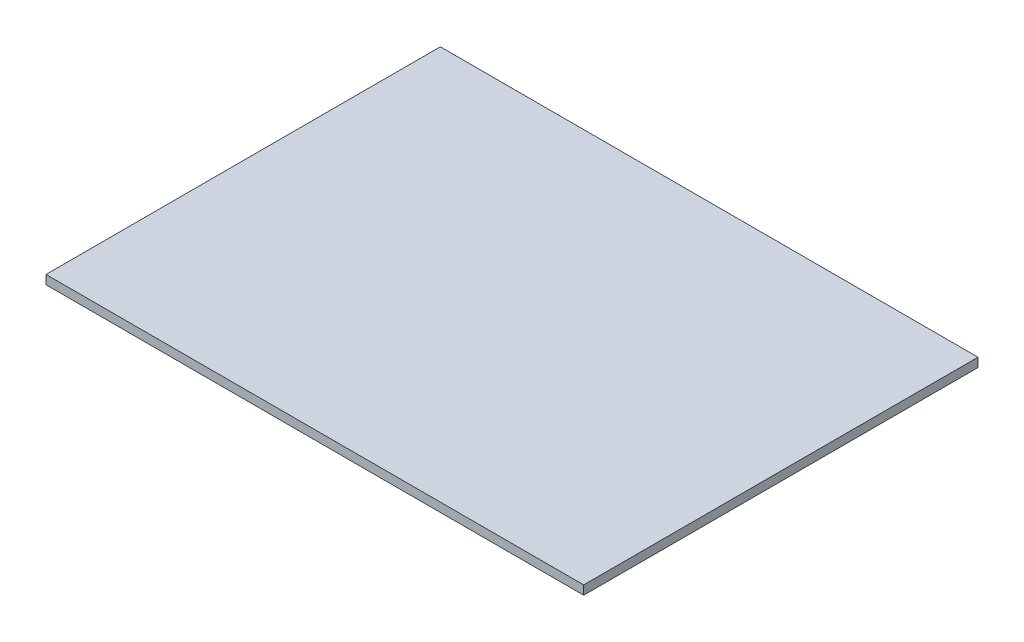
ISO-10303-21;
HEADER;
FILE_DESCRIPTION(('STEP AP214'),'2;1');
FILE_NAME('part.step','',(''),(''),'','','');
FILE_SCHEMA(('AUTOMOTIVE_DESIGN { 1 0 10303 214 1 1 1 1 }'));
ENDSEC;
DATA;
#1=APPLICATION_CONTEXT('core data for automotive mechanical design processes');
#2=APPLICATION_PROTOCOL_DEFINITION('international standard','automotive_design',2000,#1);
#3=PRODUCT_CONTEXT('',#1,'mechanical');
#4=PRODUCT('Part','Part','',(#3));
#5=PRODUCT_RELATED_PRODUCT_CATEGORY('part','',(#4));
#6=PRODUCT_DEFINITION_FORMATION('','',#4);
#7=PRODUCT_DEFINITION_CONTEXT('part definition',#1,'design');
#8=PRODUCT_DEFINITION('design','',#6,#7);
#9=PRODUCT_DEFINITION_SHAPE('','',#8);
#10=(LENGTH_UNIT() NAMED_UNIT(*) SI_UNIT(.MILLI.,.METRE.));
#11=(NAMED_UNIT(*) PLANE_ANGLE_UNIT() SI_UNIT($,.RADIAN.));
#12=(NAMED_UNIT(*) SI_UNIT($,.STERADIAN.) SOLID_ANGLE_UNIT());
#13=UNCERTAINTY_MEASURE_WITH_UNIT(LENGTH_MEASURE(1.E-05),#10,'distance_accuracy_value','');
#14=(GEOMETRIC_REPRESENTATION_CONTEXT(3) GLOBAL_UNCERTAINTY_ASSIGNED_CONTEXT((#13)) GLOBAL_UNIT_ASSIGNED_CONTEXT((#10,
#11,#12)) REPRESENTATION_CONTEXT('',''));
#15=CARTESIAN_POINT('',(0.,0.,0.));
#16=DIRECTION('',(0.,0.,1.));
#17=DIRECTION('',(1.,0.,0.));
#18=AXIS2_PLACEMENT_3D('',#15,#16,#17);
#19=CARTESIAN_POINT('',(150.,5.,-110.));
#20=DIRECTION('',(-1.,0.,0.));
#21=DIRECTION('',(0.,0.,1.));
#22=AXIS2_PLACEMENT_3D('',#19,#20,#21);
#23=PLANE('',#22);
#24=DIRECTION('',(0.,0.,-1.));
#25=VECTOR('',#24,1.);
#26=CARTESIAN_POINT('',(150.,0.,-110.));
#27=LINE('',#26,#25);
#28=CARTESIAN_POINT('',(150.,0.,110.));
#29=VERTEX_POINT('',#28);
#30=CARTESIAN_POINT('',(150.,0.,-110.));
#31=VERTEX_POINT('',#30);
#32=EDGE_CURVE('E96',#29,#31,#27,.T.);
#33=ORIENTED_EDGE('',*,*,#32,.T.);
#34=DIRECTION('',(0.,-1.,0.));
#35=VECTOR('',#34,1.);
#36=CARTESIAN_POINT('',(150.,5.,-110.));
#37=LINE('',#36,#35);
#38=CARTESIAN_POINT('',(150.,5.,-110.));
#39=VERTEX_POINT('',#38);
#40=EDGE_CURVE('E11',#39,#31,#37,.T.);
#41=ORIENTED_EDGE('',*,*,#40,.F.);
#42=DIRECTION('',(0.,0.,-1.));
#43=VECTOR('',#42,1.);
#44=CARTESIAN_POINT('',(150.,5.,-110.));
#45=LINE('',#44,#43);
#46=CARTESIAN_POINT('',(150.,5.,110.));
#47=VERTEX_POINT('',#46);
#48=EDGE_CURVE('E84',#47,#39,#45,.T.);
#49=ORIENTED_EDGE('',*,*,#48,.F.);
#50=DIRECTION('',(0.,-1.,0.));
#51=VECTOR('',#50,1.);
#52=CARTESIAN_POINT('',(150.,5.,110.));
#53=LINE('',#52,#51);
#54=EDGE_CURVE('E92',#47,#29,#53,.T.);
#55=ORIENTED_EDGE('',*,*,#54,.T.);
#56=EDGE_LOOP('',(#33,#41,#49,#55));
#57=FACE_BOUND('',#56,.T.);
#58=ADVANCED_FACE('F33',(#57),#23,.F.);
#59=CARTESIAN_POINT('',(-150.,5.,-110.));
#60=DIRECTION('',(0.,0.,1.));
#61=DIRECTION('',(1.,0.,0.));
#62=AXIS2_PLACEMENT_3D('',#59,#60,#61);
#63=PLANE('',#62);
#64=DIRECTION('',(-1.,0.,0.));
#65=VECTOR('',#64,1.);
#66=CARTESIAN_POINT('',(-150.,0.,-110.));
#67=LINE('',#66,#65);
#68=CARTESIAN_POINT('',(-150.,0.,-110.));
#69=VERTEX_POINT('',#68);
#70=EDGE_CURVE('E88',#31,#69,#67,.T.);
#71=ORIENTED_EDGE('',*,*,#70,.T.);
#72=DIRECTION('',(0.,-1.,0.));
#73=VECTOR('',#72,1.);
#74=CARTESIAN_POINT('',(-150.,5.,-110.));
#75=LINE('',#74,#73);
#76=CARTESIAN_POINT('',(-150.,5.,-110.));
#77=VERTEX_POINT('',#76);
#78=EDGE_CURVE('E41',#77,#69,#75,.T.);
#79=ORIENTED_EDGE('',*,*,#78,.F.);
#80=DIRECTION('',(-1.,0.,0.));
#81=VECTOR('',#80,1.);
#82=CARTESIAN_POINT('',(-150.,5.,-110.));
#83=LINE('',#82,#81);
#84=EDGE_CURVE('E79',#39,#77,#83,.T.);
#85=ORIENTED_EDGE('',*,*,#84,.F.);
#86=ORIENTED_EDGE('',*,*,#40,.T.);
#87=EDGE_LOOP('',(#71,#79,#85,#86));
#88=FACE_BOUND('',#87,.T.);
#89=ADVANCED_FACE('F87',(#88),#63,.F.);
#90=CARTESIAN_POINT('',(-150.,5.,-110.));
#91=DIRECTION('',(1.,0.,0.));
#92=DIRECTION('',(0.,0.,-1.));
#93=AXIS2_PLACEMENT_3D('',#90,#91,#92);
#94=PLANE('',#93);
#95=DIRECTION('',(0.,0.,1.));
#96=VECTOR('',#95,1.);
#97=CARTESIAN_POINT('',(-150.,0.,-110.));
#98=LINE('',#97,#96);
#99=CARTESIAN_POINT('',(-150.,0.,110.));
#100=VERTEX_POINT('',#99);
#101=EDGE_CURVE('E66',#69,#100,#98,.T.);
#102=ORIENTED_EDGE('',*,*,#101,.T.);
#103=DIRECTION('',(0.,-1.,0.));
#104=VECTOR('',#103,1.);
#105=CARTESIAN_POINT('',(-150.,5.,110.));
#106=LINE('',#105,#104);
#107=CARTESIAN_POINT('',(-150.,5.,110.));
#108=VERTEX_POINT('',#107);
#109=EDGE_CURVE('E89',#108,#100,#106,.T.);
#110=ORIENTED_EDGE('',*,*,#109,.F.);
#111=DIRECTION('',(0.,0.,1.));
#112=VECTOR('',#111,1.);
#113=CARTESIAN_POINT('',(-150.,5.,-110.));
#114=LINE('',#113,#112);
#115=EDGE_CURVE('E82',#77,#108,#114,.T.);
#116=ORIENTED_EDGE('',*,*,#115,.F.);
#117=ORIENTED_EDGE('',*,*,#78,.T.);
#118=EDGE_LOOP('',(#102,#110,#116,#117));
#119=FACE_BOUND('',#118,.T.);
#120=ADVANCED_FACE('F90',(#119),#94,.F.);
#121=CARTESIAN_POINT('',(-150.,5.,110.));
#122=DIRECTION('',(0.,0.,-1.));
#123=DIRECTION('',(-1.,0.,0.));
#124=AXIS2_PLACEMENT_3D('',#121,#122,#123);
#125=PLANE('',#124);
#126=DIRECTION('',(1.,0.,0.));
#127=VECTOR('',#126,1.);
#128=CARTESIAN_POINT('',(-150.,0.,110.));
#129=LINE('',#128,#127);
#130=EDGE_CURVE('E72',#100,#29,#129,.T.);
#131=ORIENTED_EDGE('',*,*,#130,.T.);
#132=ORIENTED_EDGE('',*,*,#54,.F.);
#133=DIRECTION('',(1.,0.,0.));
#134=VECTOR('',#133,1.);
#135=CARTESIAN_POINT('',(-150.,5.,110.));
#136=LINE('',#135,#134);
#137=EDGE_CURVE('E49',#108,#47,#136,.T.);
#138=ORIENTED_EDGE('',*,*,#137,.F.);
#139=ORIENTED_EDGE('',*,*,#109,.T.);
#140=EDGE_LOOP('',(#131,#132,#138,#139));
#141=FACE_BOUND('',#140,.T.);
#142=ADVANCED_FACE('F103',(#141),#125,.F.);
#143=CARTESIAN_POINT('',(0.,5.,0.));
#144=DIRECTION('',(0.,1.,0.));
#145=DIRECTION('',(0.,0.,1.));
#146=AXIS2_PLACEMENT_3D('',#143,#144,#145);
#147=PLANE('',#146);
#148=ORIENTED_EDGE('',*,*,#48,.T.);
#149=ORIENTED_EDGE('',*,*,#84,.T.);
#150=ORIENTED_EDGE('',*,*,#115,.T.);
#151=ORIENTED_EDGE('',*,*,#137,.T.);
#152=EDGE_LOOP('',(#148,#149,#150,#151));
#153=FACE_BOUND('',#152,.T.);
#154=ADVANCED_FACE('F80',(#153),#147,.T.);
#155=CARTESIAN_POINT('',(0.,0.,0.));
#156=DIRECTION('',(0.,1.,0.));
#157=DIRECTION('',(0.,0.,1.));
#158=AXIS2_PLACEMENT_3D('',#155,#156,#157);
#159=PLANE('',#158);
#160=ORIENTED_EDGE('',*,*,#32,.F.);
#161=ORIENTED_EDGE('',*,*,#130,.F.);
#162=ORIENTED_EDGE('',*,*,#101,.F.);
#163=ORIENTED_EDGE('',*,*,#70,.F.);
#164=EDGE_LOOP('',(#160,#161,#162,#163));
#165=FACE_BOUND('',#164,.T.);
#166=ADVANCED_FACE('F106',(#165),#159,.F.);
#167=CLOSED_SHELL('',(#58,#89,#120,#142,#154,#166));
#168=MANIFOLD_SOLID_BREP('B2',#167);
#169=ADVANCED_BREP_SHAPE_REPRESENTATION('',(#18,#168),#14);
#170=SHAPE_DEFINITION_REPRESENTATION(#9,#169);
ENDSEC;
END-ISO-10303-21;
